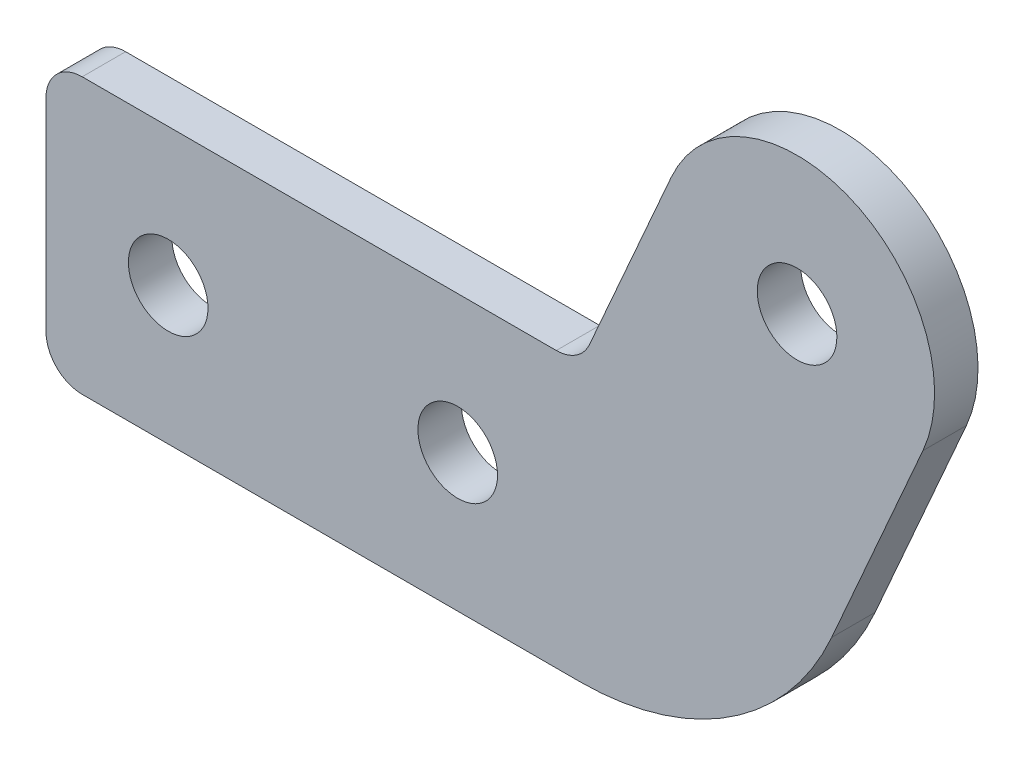
ISO-10303-21;
HEADER;
FILE_DESCRIPTION(('STEP AP214'),'2;1');
FILE_NAME('part.step','',(''),(''),'','','');
FILE_SCHEMA(('AUTOMOTIVE_DESIGN { 1 0 10303 214 1 1 1 1 }'));
ENDSEC;
DATA;
#1=APPLICATION_CONTEXT('core data for automotive mechanical design processes');
#2=APPLICATION_PROTOCOL_DEFINITION('international standard','automotive_design',2000,#1);
#3=PRODUCT_CONTEXT('',#1,'mechanical');
#4=PRODUCT('Part','Part','',(#3));
#5=PRODUCT_RELATED_PRODUCT_CATEGORY('part','',(#4));
#6=PRODUCT_DEFINITION_FORMATION('','',#4);
#7=PRODUCT_DEFINITION_CONTEXT('part definition',#1,'design');
#8=PRODUCT_DEFINITION('design','',#6,#7);
#9=PRODUCT_DEFINITION_SHAPE('','',#8);
#10=(LENGTH_UNIT() NAMED_UNIT(*) SI_UNIT(.MILLI.,.METRE.));
#11=(NAMED_UNIT(*) PLANE_ANGLE_UNIT() SI_UNIT($,.RADIAN.));
#12=(NAMED_UNIT(*) SI_UNIT($,.STERADIAN.) SOLID_ANGLE_UNIT());
#13=UNCERTAINTY_MEASURE_WITH_UNIT(LENGTH_MEASURE(1.E-05),#10,'distance_accuracy_value','');
#14=(GEOMETRIC_REPRESENTATION_CONTEXT(3) GLOBAL_UNCERTAINTY_ASSIGNED_CONTEXT((#13)) GLOBAL_UNIT_ASSIGNED_CONTEXT((#10,
#11,#12)) REPRESENTATION_CONTEXT('',''));
#15=CARTESIAN_POINT('',(0.,0.,0.));
#16=DIRECTION('',(0.,0.,1.));
#17=DIRECTION('',(1.,0.,0.));
#18=AXIS2_PLACEMENT_3D('',#15,#16,#17);
#19=CARTESIAN_POINT('',(-15.,-29.5,3.));
#20=DIRECTION('',(0.,1.,0.));
#21=DIRECTION('',(0.,0.,1.));
#22=AXIS2_PLACEMENT_3D('',#19,#20,#21);
#23=PLANE('',#22);
#24=DIRECTION('',(1.,0.,0.));
#25=VECTOR('',#24,1.);
#26=CARTESIAN_POINT('',(-15.,-29.5,3.));
#27=LINE('',#26,#25);
#28=CARTESIAN_POINT('',(-49.38,-29.5,3.));
#29=VERTEX_POINT('',#28);
#30=CARTESIAN_POINT('',(-15.,-29.5,3.));
#31=VERTEX_POINT('',#30);
#32=EDGE_CURVE('E108',#29,#31,#27,.T.);
#33=ORIENTED_EDGE('',*,*,#32,.F.);
#34=DIRECTION('',(0.,0.,-1.));
#35=VECTOR('',#34,1.);
#36=CARTESIAN_POINT('',(-49.38,-29.5,3.));
#37=LINE('',#36,#35);
#38=CARTESIAN_POINT('',(-49.38,-29.5,0.));
#39=VERTEX_POINT('',#38);
#40=EDGE_CURVE('E134',#29,#39,#37,.T.);
#41=ORIENTED_EDGE('',*,*,#40,.T.);
#42=DIRECTION('',(1.,0.,0.));
#43=VECTOR('',#42,1.);
#44=CARTESIAN_POINT('',(-15.,-29.5,0.));
#45=LINE('',#44,#43);
#46=CARTESIAN_POINT('',(-15.,-29.5,0.));
#47=VERTEX_POINT('',#46);
#48=EDGE_CURVE('E132',#39,#47,#45,.T.);
#49=ORIENTED_EDGE('',*,*,#48,.T.);
#50=DIRECTION('',(0.,0.,-1.));
#51=VECTOR('',#50,1.);
#52=CARTESIAN_POINT('',(-15.,-29.5,3.));
#53=LINE('',#52,#51);
#54=EDGE_CURVE('E125',#31,#47,#53,.T.);
#55=ORIENTED_EDGE('',*,*,#54,.F.);
#56=EDGE_LOOP('',(#33,#41,#49,#55));
#57=FACE_BOUND('',#56,.T.);
#58=ADVANCED_FACE('F33',(#57),#23,.F.);
#59=CARTESIAN_POINT('',(-15.,-10.5,3.));
#60=DIRECTION('',(0.,0.,-1.));
#61=DIRECTION('',(-1.,0.,0.));
#62=AXIS2_PLACEMENT_3D('',#59,#60,#61);
#63=CYLINDRICAL_SURFACE('',#62,19.);
#64=CARTESIAN_POINT('',(-15.,-10.5,0.));
#65=DIRECTION('',(0.,0.,1.));
#66=DIRECTION('',(-1.,0.,0.));
#67=AXIS2_PLACEMENT_3D('',#64,#65,#66);
#68=CIRCLE('',#67,19.);
#69=CARTESIAN_POINT('',(2.39051135146447,-18.153111454473,0.));
#70=VERTEX_POINT('',#69);
#71=EDGE_CURVE('E189',#47,#70,#68,.T.);
#72=ORIENTED_EDGE('',*,*,#71,.T.);
#73=DIRECTION('',(0.,0.,-1.));
#74=VECTOR('',#73,1.);
#75=CARTESIAN_POINT('',(2.39051135146447,-18.153111454473,3.));
#76=LINE('',#75,#74);
#77=CARTESIAN_POINT('',(2.39051135146447,-18.153111454473,3.));
#78=VERTEX_POINT('',#77);
#79=EDGE_CURVE('E127',#78,#70,#76,.T.);
#80=ORIENTED_EDGE('',*,*,#79,.F.);
#81=CARTESIAN_POINT('',(-15.,-10.5,3.));
#82=DIRECTION('',(0.,0.,1.));
#83=DIRECTION('',(-1.,0.,0.));
#84=AXIS2_PLACEMENT_3D('',#81,#82,#83);
#85=CIRCLE('',#84,19.);
#86=EDGE_CURVE('E112',#31,#78,#85,.T.);
#87=ORIENTED_EDGE('',*,*,#86,.F.);
#88=ORIENTED_EDGE('',*,*,#54,.T.);
#89=EDGE_LOOP('',(#72,#80,#87,#88));
#90=FACE_BOUND('',#89,.T.);
#91=ADVANCED_FACE('F124',(#90),#63,.T.);
#92=CARTESIAN_POINT('',(8.69525567573223,-3.82655572723652,3.));
#93=DIRECTION('',(-0.915290071129708,0.402795339709106,0.));
#94=DIRECTION('',(-0.402795339709107,-0.915290071129708,0.));
#95=AXIS2_PLACEMENT_3D('',#92,#93,#94);
#96=PLANE('',#95);
#97=DIRECTION('',(0.402795339709107,0.915290071129708,0.));
#98=VECTOR('',#97,1.);
#99=CARTESIAN_POINT('',(8.69525567573223,-3.82655572723652,0.));
#100=LINE('',#99,#98);
#101=CARTESIAN_POINT('',(8.69525567573223,-3.82655572723651,0.));
#102=VERTEX_POINT('',#101);
#103=EDGE_CURVE('E192',#70,#102,#100,.T.);
#104=ORIENTED_EDGE('',*,*,#103,.T.);
#105=DIRECTION('',(0.,0.,-1.));
#106=VECTOR('',#105,1.);
#107=CARTESIAN_POINT('',(8.69525567573223,-3.82655572723651,3.));
#108=LINE('',#107,#106);
#109=CARTESIAN_POINT('',(8.69525567573223,-3.82655572723651,3.));
#110=VERTEX_POINT('',#109);
#111=EDGE_CURVE('E138',#110,#102,#108,.T.);
#112=ORIENTED_EDGE('',*,*,#111,.F.);
#113=DIRECTION('',(0.402795339709107,0.915290071129708,0.));
#114=VECTOR('',#113,1.);
#115=CARTESIAN_POINT('',(8.69525567573223,-3.82655572723652,3.));
#116=LINE('',#115,#114);
#117=EDGE_CURVE('E129',#78,#110,#116,.T.);
#118=ORIENTED_EDGE('',*,*,#117,.F.);
#119=ORIENTED_EDGE('',*,*,#79,.T.);
#120=EDGE_LOOP('',(#104,#112,#118,#119));
#121=FACE_BOUND('',#120,.T.);
#122=ADVANCED_FACE('F205',(#121),#96,.F.);
#123=CARTESIAN_POINT('',(0.,0.,3.));
#124=DIRECTION('',(0.,0.,-1.));
#125=DIRECTION('',(-1.,0.,0.));
#126=AXIS2_PLACEMENT_3D('',#123,#124,#125);
#127=CYLINDRICAL_SURFACE('',#126,9.50000000000001);
#128=CARTESIAN_POINT('',(0.,0.,0.));
#129=DIRECTION('',(0.,0.,1.));
#130=DIRECTION('',(1.,0.,0.));
#131=AXIS2_PLACEMENT_3D('',#128,#129,#130);
#132=CIRCLE('',#131,9.50000000000001);
#133=CARTESIAN_POINT('',(-8.69525567573223,3.82655572723652,0.));
#134=VERTEX_POINT('',#133);
#135=EDGE_CURVE('E175',#102,#134,#132,.T.);
#136=ORIENTED_EDGE('',*,*,#135,.T.);
#137=DIRECTION('',(0.,0.,-1.));
#138=VECTOR('',#137,1.);
#139=CARTESIAN_POINT('',(-8.69525567573223,3.82655572723652,3.));
#140=LINE('',#139,#138);
#141=CARTESIAN_POINT('',(-8.69525567573223,3.82655572723652,3.));
#142=VERTEX_POINT('',#141);
#143=EDGE_CURVE('E174',#142,#134,#140,.T.);
#144=ORIENTED_EDGE('',*,*,#143,.F.);
#145=CARTESIAN_POINT('',(0.,0.,3.));
#146=DIRECTION('',(0.,0.,1.));
#147=DIRECTION('',(1.,0.,0.));
#148=AXIS2_PLACEMENT_3D('',#145,#146,#147);
#149=CIRCLE('',#148,9.50000000000001);
#150=EDGE_CURVE('E184',#110,#142,#149,.T.);
#151=ORIENTED_EDGE('',*,*,#150,.F.);
#152=ORIENTED_EDGE('',*,*,#111,.T.);
#153=EDGE_LOOP('',(#136,#144,#151,#152));
#154=FACE_BOUND('',#153,.T.);
#155=ADVANCED_FACE('F202',(#154),#127,.T.);
#156=CARTESIAN_POINT('',(-15.,-10.5,3.));
#157=DIRECTION('',(0.915290071129708,-0.402795339709107,0.));
#158=DIRECTION('',(0.402795339709107,0.915290071129708,0.));
#159=AXIS2_PLACEMENT_3D('',#156,#157,#158);
#160=PLANE('',#159);
#161=DIRECTION('',(-0.402795339709107,-0.915290071129708,0.));
#162=VECTOR('',#161,1.);
#163=CARTESIAN_POINT('',(-15.,-10.5,0.));
#164=LINE('',#163,#162);
#165=CARTESIAN_POINT('',(-14.3429644284221,-9.00698834927277,0.));
#166=VERTEX_POINT('',#165);
#167=EDGE_CURVE('E164',#134,#166,#164,.T.);
#168=ORIENTED_EDGE('',*,*,#167,.T.);
#169=DIRECTION('',(0.,0.,-1.));
#170=VECTOR('',#169,1.);
#171=CARTESIAN_POINT('',(-14.3429644284221,-9.00698834927277,3.));
#172=LINE('',#171,#170);
#173=CARTESIAN_POINT('',(-14.3429644284221,-9.00698834927277,3.));
#174=VERTEX_POINT('',#173);
#175=EDGE_CURVE('E157',#166,#174,#172,.F.);
#176=ORIENTED_EDGE('',*,*,#175,.T.);
#177=DIRECTION('',(-0.402795339709107,-0.915290071129708,0.));
#178=VECTOR('',#177,1.);
#179=CARTESIAN_POINT('',(-15.,-10.5,3.));
#180=LINE('',#179,#178);
#181=EDGE_CURVE('E181',#142,#174,#180,.T.);
#182=ORIENTED_EDGE('',*,*,#181,.F.);
#183=ORIENTED_EDGE('',*,*,#143,.T.);
#184=EDGE_LOOP('',(#168,#176,#182,#183));
#185=FACE_BOUND('',#184,.T.);
#186=ADVANCED_FACE('F171',(#185),#160,.F.);
#187=CARTESIAN_POINT('',(-51.88,-10.5,3.));
#188=DIRECTION('',(0.,-1.,0.));
#189=DIRECTION('',(0.,0.,-1.));
#190=AXIS2_PLACEMENT_3D('',#187,#188,#189);
#191=PLANE('',#190);
#192=DIRECTION('',(-1.,0.,0.));
#193=VECTOR('',#192,1.);
#194=CARTESIAN_POINT('',(-51.88,-10.5,0.));
#195=LINE('',#194,#193);
#196=CARTESIAN_POINT('',(-16.6311896062463,-10.5,0.));
#197=VERTEX_POINT('',#196);
#198=CARTESIAN_POINT('',(-49.38,-10.5,0.));
#199=VERTEX_POINT('',#198);
#200=EDGE_CURVE('E165',#197,#199,#195,.T.);
#201=ORIENTED_EDGE('',*,*,#200,.T.);
#202=DIRECTION('',(0.,0.,-1.));
#203=VECTOR('',#202,1.);
#204=CARTESIAN_POINT('',(-49.38,-10.5,3.));
#205=LINE('',#204,#203);
#206=CARTESIAN_POINT('',(-49.38,-10.5,3.));
#207=VERTEX_POINT('',#206);
#208=EDGE_CURVE('E48',#199,#207,#205,.F.);
#209=ORIENTED_EDGE('',*,*,#208,.T.);
#210=DIRECTION('',(-1.,0.,0.));
#211=VECTOR('',#210,1.);
#212=CARTESIAN_POINT('',(-51.88,-10.5,3.));
#213=LINE('',#212,#211);
#214=CARTESIAN_POINT('',(-16.6311896062463,-10.5,3.));
#215=VERTEX_POINT('',#214);
#216=EDGE_CURVE('E178',#215,#207,#213,.T.);
#217=ORIENTED_EDGE('',*,*,#216,.F.);
#218=DIRECTION('',(0.,0.,-1.));
#219=VECTOR('',#218,1.);
#220=CARTESIAN_POINT('',(-16.6311896062463,-10.5,0.));
#221=LINE('',#220,#219);
#222=EDGE_CURVE('E153',#215,#197,#221,.T.);
#223=ORIENTED_EDGE('',*,*,#222,.T.);
#224=EDGE_LOOP('',(#201,#209,#217,#223));
#225=FACE_BOUND('',#224,.T.);
#226=ADVANCED_FACE('F177',(#225),#191,.F.);
#227=CARTESIAN_POINT('',(-51.88,-10.5,3.));
#228=DIRECTION('',(1.,0.,0.));
#229=DIRECTION('',(0.,0.,-1.));
#230=AXIS2_PLACEMENT_3D('',#227,#228,#229);
#231=PLANE('',#230);
#232=DIRECTION('',(0.,-1.,0.));
#233=VECTOR('',#232,1.);
#234=CARTESIAN_POINT('',(-51.88,-10.5,0.));
#235=LINE('',#234,#233);
#236=CARTESIAN_POINT('',(-51.88,-13.,0.));
#237=VERTEX_POINT('',#236);
#238=CARTESIAN_POINT('',(-51.88,-27.,0.));
#239=VERTEX_POINT('',#238);
#240=EDGE_CURVE('E120',#237,#239,#235,.T.);
#241=ORIENTED_EDGE('',*,*,#240,.T.);
#242=DIRECTION('',(0.,0.,-1.));
#243=VECTOR('',#242,1.);
#244=CARTESIAN_POINT('',(-51.88,-27.,3.));
#245=LINE('',#244,#243);
#246=CARTESIAN_POINT('',(-51.88,-27.,3.));
#247=VERTEX_POINT('',#246);
#248=EDGE_CURVE('E148',#239,#247,#245,.F.);
#249=ORIENTED_EDGE('',*,*,#248,.T.);
#250=DIRECTION('',(0.,-1.,0.));
#251=VECTOR('',#250,1.);
#252=CARTESIAN_POINT('',(-51.88,-10.5,3.));
#253=LINE('',#252,#251);
#254=CARTESIAN_POINT('',(-51.88,-13.,3.));
#255=VERTEX_POINT('',#254);
#256=EDGE_CURVE('E180',#255,#247,#253,.T.);
#257=ORIENTED_EDGE('',*,*,#256,.F.);
#258=DIRECTION('',(0.,0.,-1.));
#259=VECTOR('',#258,1.);
#260=CARTESIAN_POINT('',(-51.88,-13.,3.));
#261=LINE('',#260,#259);
#262=EDGE_CURVE('E145',#255,#237,#261,.T.);
#263=ORIENTED_EDGE('',*,*,#262,.T.);
#264=EDGE_LOOP('',(#241,#249,#257,#263));
#265=FACE_BOUND('',#264,.T.);
#266=ADVANCED_FACE('F230',(#265),#231,.F.);
#267=CARTESIAN_POINT('',(0.,0.,3.));
#268=DIRECTION('',(0.,0.,1.));
#269=DIRECTION('',(1.,0.,0.));
#270=AXIS2_PLACEMENT_3D('',#267,#268,#269);
#271=PLANE('',#270);
#272=CARTESIAN_POINT('',(0.,0.,3.));
#273=DIRECTION('',(0.,0.,1.));
#274=DIRECTION('',(1.,0.,0.));
#275=AXIS2_PLACEMENT_3D('',#272,#273,#274);
#276=CIRCLE('',#275,2.74999999999999);
#277=CARTESIAN_POINT('',(2.74999999999999,0.,3.));
#278=VERTEX_POINT('',#277);
#279=EDGE_CURVE('E222',#278,#278,#276,.T.);
#280=ORIENTED_EDGE('',*,*,#279,.F.);
#281=EDGE_LOOP('',(#280));
#282=FACE_BOUND('',#281,.T.);
#283=CARTESIAN_POINT('',(-23.44,-20.,3.));
#284=DIRECTION('',(0.,0.,1.));
#285=DIRECTION('',(1.,0.,0.));
#286=AXIS2_PLACEMENT_3D('',#283,#284,#285);
#287=CIRCLE('',#286,2.74999999999999);
#288=CARTESIAN_POINT('',(-20.69,-20.,3.));
#289=VERTEX_POINT('',#288);
#290=EDGE_CURVE('E216',#289,#289,#287,.T.);
#291=ORIENTED_EDGE('',*,*,#290,.F.);
#292=EDGE_LOOP('',(#291));
#293=FACE_BOUND('',#292,.T.);
#294=CARTESIAN_POINT('',(-43.44,-20.,3.));
#295=DIRECTION('',(0.,0.,1.));
#296=DIRECTION('',(1.,0.,0.));
#297=AXIS2_PLACEMENT_3D('',#294,#295,#296);
#298=CIRCLE('',#297,2.74999999999999);
#299=CARTESIAN_POINT('',(-40.69,-20.,3.));
#300=VERTEX_POINT('',#299);
#301=EDGE_CURVE('E210',#300,#300,#298,.T.);
#302=ORIENTED_EDGE('',*,*,#301,.F.);
#303=EDGE_LOOP('',(#302));
#304=FACE_BOUND('',#303,.T.);
#305=ORIENTED_EDGE('',*,*,#256,.T.);
#306=CARTESIAN_POINT('',(-49.38,-27.,3.));
#307=DIRECTION('',(0.,0.,1.));
#308=DIRECTION('',(1.,0.,0.));
#309=AXIS2_PLACEMENT_3D('',#306,#307,#308);
#310=CIRCLE('',#309,2.5);
#311=EDGE_CURVE('E115',#247,#29,#310,.T.);
#312=ORIENTED_EDGE('',*,*,#311,.T.);
#313=ORIENTED_EDGE('',*,*,#32,.T.);
#314=ORIENTED_EDGE('',*,*,#86,.T.);
#315=ORIENTED_EDGE('',*,*,#117,.T.);
#316=ORIENTED_EDGE('',*,*,#150,.T.);
#317=ORIENTED_EDGE('',*,*,#181,.T.);
#318=CARTESIAN_POINT('',(-16.6311896062463,-8.00000000000001,3.));
#319=DIRECTION('',(0.,0.,1.));
#320=DIRECTION('',(1.,0.,0.));
#321=AXIS2_PLACEMENT_3D('',#318,#319,#320);
#322=CIRCLE('',#321,2.5);
#323=EDGE_CURVE('E11',#174,#215,#322,.F.);
#324=ORIENTED_EDGE('',*,*,#323,.T.);
#325=ORIENTED_EDGE('',*,*,#216,.T.);
#326=CARTESIAN_POINT('',(-49.38,-13.,3.));
#327=DIRECTION('',(0.,0.,1.));
#328=DIRECTION('',(1.,0.,0.));
#329=AXIS2_PLACEMENT_3D('',#326,#327,#328);
#330=CIRCLE('',#329,2.5);
#331=EDGE_CURVE('E150',#207,#255,#330,.T.);
#332=ORIENTED_EDGE('',*,*,#331,.T.);
#333=EDGE_LOOP('',(#305,#312,#313,#314,#315,#316,#317,#324,#325,#332));
#334=FACE_BOUND('',#333,.T.);
#335=ADVANCED_FACE('F111',(#282,#293,#304,#334),#271,.T.);
#336=CARTESIAN_POINT('',(0.,0.,0.));
#337=DIRECTION('',(0.,0.,1.));
#338=DIRECTION('',(1.,0.,0.));
#339=AXIS2_PLACEMENT_3D('',#336,#337,#338);
#340=PLANE('',#339);
#341=CARTESIAN_POINT('',(0.,0.,0.));
#342=DIRECTION('',(0.,0.,1.));
#343=DIRECTION('',(1.,0.,0.));
#344=AXIS2_PLACEMENT_3D('',#341,#342,#343);
#345=CIRCLE('',#344,2.74999999999999);
#346=CARTESIAN_POINT('',(2.74999999999999,0.,0.));
#347=VERTEX_POINT('',#346);
#348=EDGE_CURVE('E219',#347,#347,#345,.T.);
#349=ORIENTED_EDGE('',*,*,#348,.T.);
#350=EDGE_LOOP('',(#349));
#351=FACE_BOUND('',#350,.T.);
#352=CARTESIAN_POINT('',(-23.44,-20.,0.));
#353=DIRECTION('',(0.,0.,1.));
#354=DIRECTION('',(1.,0.,0.));
#355=AXIS2_PLACEMENT_3D('',#352,#353,#354);
#356=CIRCLE('',#355,2.74999999999999);
#357=CARTESIAN_POINT('',(-20.69,-20.,0.));
#358=VERTEX_POINT('',#357);
#359=EDGE_CURVE('E213',#358,#358,#356,.T.);
#360=ORIENTED_EDGE('',*,*,#359,.T.);
#361=EDGE_LOOP('',(#360));
#362=FACE_BOUND('',#361,.T.);
#363=CARTESIAN_POINT('',(-43.44,-20.,0.));
#364=DIRECTION('',(0.,0.,1.));
#365=DIRECTION('',(1.,0.,0.));
#366=AXIS2_PLACEMENT_3D('',#363,#364,#365);
#367=CIRCLE('',#366,2.75);
#368=CARTESIAN_POINT('',(-40.69,-20.,0.));
#369=VERTEX_POINT('',#368);
#370=EDGE_CURVE('E190',#369,#369,#367,.T.);
#371=ORIENTED_EDGE('',*,*,#370,.T.);
#372=EDGE_LOOP('',(#371));
#373=FACE_BOUND('',#372,.T.);
#374=ORIENTED_EDGE('',*,*,#48,.F.);
#375=CARTESIAN_POINT('',(-49.38,-27.,0.));
#376=DIRECTION('',(0.,0.,1.));
#377=DIRECTION('',(1.,0.,0.));
#378=AXIS2_PLACEMENT_3D('',#375,#376,#377);
#379=CIRCLE('',#378,2.5);
#380=EDGE_CURVE('E143',#39,#239,#379,.F.);
#381=ORIENTED_EDGE('',*,*,#380,.T.);
#382=ORIENTED_EDGE('',*,*,#240,.F.);
#383=CARTESIAN_POINT('',(-49.38,-13.,0.));
#384=DIRECTION('',(0.,0.,1.));
#385=DIRECTION('',(1.,0.,0.));
#386=AXIS2_PLACEMENT_3D('',#383,#384,#385);
#387=CIRCLE('',#386,2.5);
#388=EDGE_CURVE('E136',#237,#199,#387,.F.);
#389=ORIENTED_EDGE('',*,*,#388,.T.);
#390=ORIENTED_EDGE('',*,*,#200,.F.);
#391=CARTESIAN_POINT('',(-16.6311896062463,-8.00000000000001,0.));
#392=DIRECTION('',(0.,0.,1.));
#393=DIRECTION('',(1.,0.,0.));
#394=AXIS2_PLACEMENT_3D('',#391,#392,#393);
#395=CIRCLE('',#394,2.5);
#396=EDGE_CURVE('E41',#197,#166,#395,.T.);
#397=ORIENTED_EDGE('',*,*,#396,.T.);
#398=ORIENTED_EDGE('',*,*,#167,.F.);
#399=ORIENTED_EDGE('',*,*,#135,.F.);
#400=ORIENTED_EDGE('',*,*,#103,.F.);
#401=ORIENTED_EDGE('',*,*,#71,.F.);
#402=EDGE_LOOP('',(#374,#381,#382,#389,#390,#397,#398,#399,#400,#401));
#403=FACE_BOUND('',#402,.T.);
#404=ADVANCED_FACE('F162',(#351,#362,#373,#403),#340,.F.);
#405=CARTESIAN_POINT('',(-43.44,-20.,3.));
#406=DIRECTION('',(0.,0.,1.));
#407=DIRECTION('',(1.,0.,0.));
#408=AXIS2_PLACEMENT_3D('',#405,#406,#407);
#409=CYLINDRICAL_SURFACE('',#408,2.75);
#410=ORIENTED_EDGE('',*,*,#370,.F.);
#411=EDGE_LOOP('',(#410));
#412=FACE_BOUND('',#411,.T.);
#413=ORIENTED_EDGE('',*,*,#301,.T.);
#414=EDGE_LOOP('',(#413));
#415=FACE_BOUND('',#414,.T.);
#416=ADVANCED_FACE('F236',(#412,#415),#409,.F.);
#417=CARTESIAN_POINT('',(-23.44,-20.,3.));
#418=DIRECTION('',(0.,0.,1.));
#419=DIRECTION('',(1.,0.,0.));
#420=AXIS2_PLACEMENT_3D('',#417,#418,#419);
#421=CYLINDRICAL_SURFACE('',#420,2.74999999999999);
#422=ORIENTED_EDGE('',*,*,#359,.F.);
#423=EDGE_LOOP('',(#422));
#424=FACE_BOUND('',#423,.T.);
#425=ORIENTED_EDGE('',*,*,#290,.T.);
#426=EDGE_LOOP('',(#425));
#427=FACE_BOUND('',#426,.T.);
#428=ADVANCED_FACE('F238',(#424,#427),#421,.F.);
#429=CARTESIAN_POINT('',(0.,0.,3.));
#430=DIRECTION('',(0.,0.,1.));
#431=DIRECTION('',(1.,0.,0.));
#432=AXIS2_PLACEMENT_3D('',#429,#430,#431);
#433=CYLINDRICAL_SURFACE('',#432,2.74999999999999);
#434=ORIENTED_EDGE('',*,*,#348,.F.);
#435=EDGE_LOOP('',(#434));
#436=FACE_BOUND('',#435,.T.);
#437=ORIENTED_EDGE('',*,*,#279,.T.);
#438=EDGE_LOOP('',(#437));
#439=FACE_BOUND('',#438,.T.);
#440=ADVANCED_FACE('F226',(#436,#439),#433,.F.);
#441=CARTESIAN_POINT('',(-49.38,-27.,3.));
#442=DIRECTION('',(0.,0.,-1.));
#443=DIRECTION('',(-1.,0.,0.));
#444=AXIS2_PLACEMENT_3D('',#441,#442,#443);
#445=CYLINDRICAL_SURFACE('',#444,2.5);
#446=ORIENTED_EDGE('',*,*,#311,.F.);
#447=ORIENTED_EDGE('',*,*,#248,.F.);
#448=ORIENTED_EDGE('',*,*,#380,.F.);
#449=ORIENTED_EDGE('',*,*,#40,.F.);
#450=EDGE_LOOP('',(#446,#447,#448,#449));
#451=FACE_BOUND('',#450,.T.);
#452=ADVANCED_FACE('F258',(#451),#445,.T.);
#453=CARTESIAN_POINT('',(-49.38,-13.,3.));
#454=DIRECTION('',(0.,0.,-1.));
#455=DIRECTION('',(-1.,0.,0.));
#456=AXIS2_PLACEMENT_3D('',#453,#454,#455);
#457=CYLINDRICAL_SURFACE('',#456,2.5);
#458=ORIENTED_EDGE('',*,*,#331,.F.);
#459=ORIENTED_EDGE('',*,*,#208,.F.);
#460=ORIENTED_EDGE('',*,*,#388,.F.);
#461=ORIENTED_EDGE('',*,*,#262,.F.);
#462=EDGE_LOOP('',(#458,#459,#460,#461));
#463=FACE_BOUND('',#462,.T.);
#464=ADVANCED_FACE('F260',(#463),#457,.T.);
#465=CARTESIAN_POINT('',(-16.6311896062463,-8.00000000000001,3.));
#466=DIRECTION('',(0.,0.,1.));
#467=DIRECTION('',(1.,0.,0.));
#468=AXIS2_PLACEMENT_3D('',#465,#466,#467);
#469=CYLINDRICAL_SURFACE('',#468,2.5);
#470=ORIENTED_EDGE('',*,*,#323,.F.);
#471=ORIENTED_EDGE('',*,*,#175,.F.);
#472=ORIENTED_EDGE('',*,*,#396,.F.);
#473=ORIENTED_EDGE('',*,*,#222,.F.);
#474=EDGE_LOOP('',(#470,#471,#472,#473));
#475=FACE_BOUND('',#474,.T.);
#476=ADVANCED_FACE('F35',(#475),#469,.F.);
#477=CLOSED_SHELL('',(#58,#91,#122,#155,#186,#226,#266,#335,#404,#416,#428,#440,#452,#464,#476));
#478=MANIFOLD_SOLID_BREP('B2',#477);
#479=ADVANCED_BREP_SHAPE_REPRESENTATION('',(#18,#478),#14);
#480=SHAPE_DEFINITION_REPRESENTATION(#9,#479);
ENDSEC;
END-ISO-10303-21;
